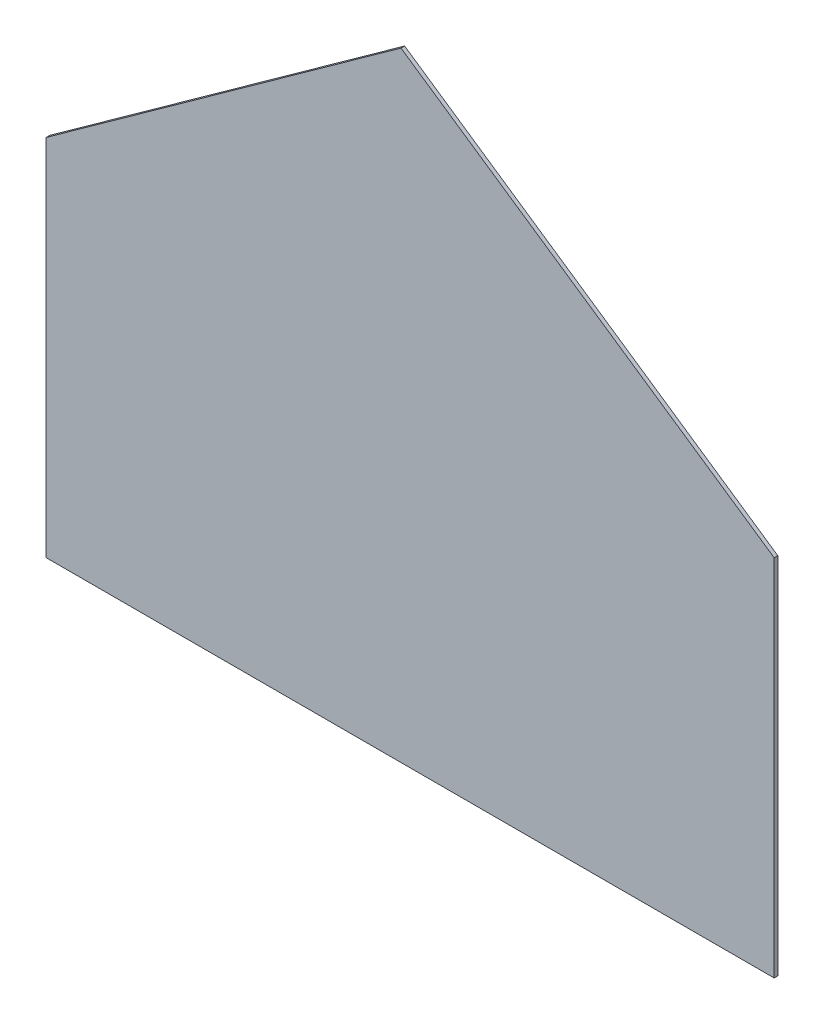
ISO-10303-21;
HEADER;
FILE_DESCRIPTION(('STEP AP214'),'2;1');
FILE_NAME('part.step','',(''),(''),'','','');
FILE_SCHEMA(('AUTOMOTIVE_DESIGN { 1 0 10303 214 1 1 1 1 }'));
ENDSEC;
DATA;
#1=APPLICATION_CONTEXT('core data for automotive mechanical design processes');
#2=APPLICATION_PROTOCOL_DEFINITION('international standard','automotive_design',2000,#1);
#3=PRODUCT_CONTEXT('',#1,'mechanical');
#4=PRODUCT('Part','Part','',(#3));
#5=PRODUCT_RELATED_PRODUCT_CATEGORY('part','',(#4));
#6=PRODUCT_DEFINITION_FORMATION('','',#4);
#7=PRODUCT_DEFINITION_CONTEXT('part definition',#1,'design');
#8=PRODUCT_DEFINITION('design','',#6,#7);
#9=PRODUCT_DEFINITION_SHAPE('','',#8);
#10=(LENGTH_UNIT() NAMED_UNIT(*) SI_UNIT(.MILLI.,.METRE.));
#11=(NAMED_UNIT(*) PLANE_ANGLE_UNIT() SI_UNIT($,.RADIAN.));
#12=(NAMED_UNIT(*) SI_UNIT($,.STERADIAN.) SOLID_ANGLE_UNIT());
#13=UNCERTAINTY_MEASURE_WITH_UNIT(LENGTH_MEASURE(1.E-05),#10,'distance_accuracy_value','');
#14=(GEOMETRIC_REPRESENTATION_CONTEXT(3) GLOBAL_UNCERTAINTY_ASSIGNED_CONTEXT((#13)) GLOBAL_UNIT_ASSIGNED_CONTEXT((#10,
#11,#12)) REPRESENTATION_CONTEXT('',''));
#15=CARTESIAN_POINT('',(0.,0.,0.));
#16=DIRECTION('',(0.,0.,1.));
#17=DIRECTION('',(1.,0.,0.));
#18=AXIS2_PLACEMENT_3D('',#15,#16,#17);
#19=CARTESIAN_POINT('',(-254.,0.,1.27));
#20=DIRECTION('',(1.,0.,0.));
#21=DIRECTION('',(0.,0.,-1.));
#22=AXIS2_PLACEMENT_3D('',#19,#20,#21);
#23=PLANE('',#22);
#24=DIRECTION('',(0.,-1.,0.));
#25=VECTOR('',#24,1.);
#26=CARTESIAN_POINT('',(-254.,0.,-1.27));
#27=LINE('',#26,#25);
#28=CARTESIAN_POINT('',(-254.,254.,-1.27));
#29=VERTEX_POINT('',#28);
#30=CARTESIAN_POINT('',(-254.,0.,-1.27));
#31=VERTEX_POINT('',#30);
#32=EDGE_CURVE('E122',#29,#31,#27,.T.);
#33=ORIENTED_EDGE('',*,*,#32,.T.);
#34=DIRECTION('',(0.,0.,-1.));
#35=VECTOR('',#34,1.);
#36=CARTESIAN_POINT('',(-254.,0.,1.27));
#37=LINE('',#36,#35);
#38=CARTESIAN_POINT('',(-254.,0.,1.27));
#39=VERTEX_POINT('',#38);
#40=EDGE_CURVE('E11',#39,#31,#37,.T.);
#41=ORIENTED_EDGE('',*,*,#40,.F.);
#42=DIRECTION('',(0.,-1.,0.));
#43=VECTOR('',#42,1.);
#44=CARTESIAN_POINT('',(-254.,0.,1.27));
#45=LINE('',#44,#43);
#46=CARTESIAN_POINT('',(-254.,254.,1.27));
#47=VERTEX_POINT('',#46);
#48=EDGE_CURVE('E135',#47,#39,#45,.T.);
#49=ORIENTED_EDGE('',*,*,#48,.F.);
#50=DIRECTION('',(0.,0.,-1.));
#51=VECTOR('',#50,1.);
#52=CARTESIAN_POINT('',(-254.,254.,1.27));
#53=LINE('',#52,#51);
#54=EDGE_CURVE('E118',#47,#29,#53,.T.);
#55=ORIENTED_EDGE('',*,*,#54,.T.);
#56=EDGE_LOOP('',(#33,#41,#49,#55));
#57=FACE_BOUND('',#56,.T.);
#58=ADVANCED_FACE('F43',(#57),#23,.F.);
#59=CARTESIAN_POINT('',(-254.,0.,1.27));
#60=DIRECTION('',(0.,1.,0.));
#61=DIRECTION('',(-1.,0.,0.));
#62=AXIS2_PLACEMENT_3D('',#59,#60,#61);
#63=PLANE('',#62);
#64=DIRECTION('',(1.,0.,0.));
#65=VECTOR('',#64,1.);
#66=CARTESIAN_POINT('',(-254.,0.,-1.27));
#67=LINE('',#66,#65);
#68=CARTESIAN_POINT('',(254.,0.,-1.27));
#69=VERTEX_POINT('',#68);
#70=EDGE_CURVE('E126',#31,#69,#67,.T.);
#71=ORIENTED_EDGE('',*,*,#70,.T.);
#72=DIRECTION('',(0.,0.,-1.));
#73=VECTOR('',#72,1.);
#74=CARTESIAN_POINT('',(254.,0.,1.27));
#75=LINE('',#74,#73);
#76=CARTESIAN_POINT('',(254.,0.,1.27));
#77=VERTEX_POINT('',#76);
#78=EDGE_CURVE('E52',#77,#69,#75,.T.);
#79=ORIENTED_EDGE('',*,*,#78,.F.);
#80=DIRECTION('',(1.,0.,0.));
#81=VECTOR('',#80,1.);
#82=CARTESIAN_POINT('',(-254.,0.,1.27));
#83=LINE('',#82,#81);
#84=EDGE_CURVE('E94',#39,#77,#83,.T.);
#85=ORIENTED_EDGE('',*,*,#84,.F.);
#86=ORIENTED_EDGE('',*,*,#40,.T.);
#87=EDGE_LOOP('',(#71,#79,#85,#86));
#88=FACE_BOUND('',#87,.T.);
#89=ADVANCED_FACE('F157',(#88),#63,.F.);
#90=CARTESIAN_POINT('',(254.,0.,1.27));
#91=DIRECTION('',(-1.,0.,0.));
#92=DIRECTION('',(0.,0.,1.));
#93=AXIS2_PLACEMENT_3D('',#90,#91,#92);
#94=PLANE('',#93);
#95=DIRECTION('',(0.,1.,0.));
#96=VECTOR('',#95,1.);
#97=CARTESIAN_POINT('',(254.,0.,-1.27));
#98=LINE('',#97,#96);
#99=CARTESIAN_POINT('',(254.,254.,-1.27));
#100=VERTEX_POINT('',#99);
#101=EDGE_CURVE('E110',#69,#100,#98,.T.);
#102=ORIENTED_EDGE('',*,*,#101,.T.);
#103=DIRECTION('',(0.,0.,-1.));
#104=VECTOR('',#103,1.);
#105=CARTESIAN_POINT('',(254.,254.,1.27));
#106=LINE('',#105,#104);
#107=CARTESIAN_POINT('',(254.,254.,1.27));
#108=VERTEX_POINT('',#107);
#109=EDGE_CURVE('E107',#108,#100,#106,.T.);
#110=ORIENTED_EDGE('',*,*,#109,.F.);
#111=DIRECTION('',(0.,1.,0.));
#112=VECTOR('',#111,1.);
#113=CARTESIAN_POINT('',(254.,0.,1.27));
#114=LINE('',#113,#112);
#115=EDGE_CURVE('E98',#77,#108,#114,.T.);
#116=ORIENTED_EDGE('',*,*,#115,.F.);
#117=ORIENTED_EDGE('',*,*,#78,.T.);
#118=EDGE_LOOP('',(#102,#110,#116,#117));
#119=FACE_BOUND('',#118,.T.);
#120=ADVANCED_FACE('F108',(#119),#94,.F.);
#121=CARTESIAN_POINT('',(-6.41461279698348,431.776590257358,1.27));
#122=DIRECTION('',(-0.563815572471546,-0.825900720570326,0.));
#123=DIRECTION('',(0.825900720570326,-0.563815572471546,0.));
#124=AXIS2_PLACEMENT_3D('',#121,#122,#123);
#125=PLANE('',#124);
#126=DIRECTION('',(-0.825900720570326,0.563815572471546,0.));
#127=VECTOR('',#126,1.);
#128=CARTESIAN_POINT('',(-6.41461279698348,431.776590257358,-1.27));
#129=LINE('',#128,#127);
#130=CARTESIAN_POINT('',(-6.41461279698348,431.776590257358,-1.27));
#131=VERTEX_POINT('',#130);
#132=EDGE_CURVE('E80',#100,#131,#129,.T.);
#133=ORIENTED_EDGE('',*,*,#132,.T.);
#134=DIRECTION('',(0.,0.,-1.));
#135=VECTOR('',#134,1.);
#136=CARTESIAN_POINT('',(-6.41461279698348,431.776590257358,1.27));
#137=LINE('',#136,#135);
#138=CARTESIAN_POINT('',(-6.41461279698348,431.776590257358,1.27));
#139=VERTEX_POINT('',#138);
#140=EDGE_CURVE('E112',#139,#131,#137,.T.);
#141=ORIENTED_EDGE('',*,*,#140,.F.);
#142=DIRECTION('',(-0.825900720570326,0.563815572471546,0.));
#143=VECTOR('',#142,1.);
#144=CARTESIAN_POINT('',(-6.41461279698348,431.776590257358,1.27));
#145=LINE('',#144,#143);
#146=EDGE_CURVE('E102',#108,#139,#145,.T.);
#147=ORIENTED_EDGE('',*,*,#146,.F.);
#148=ORIENTED_EDGE('',*,*,#109,.T.);
#149=EDGE_LOOP('',(#133,#141,#147,#148));
#150=FACE_BOUND('',#149,.T.);
#151=ADVANCED_FACE('F114',(#150),#125,.F.);
#152=CARTESIAN_POINT('',(-254.,254.,1.27));
#153=DIRECTION('',(0.58325652971574,-0.812288015757928,0.));
#154=DIRECTION('',(0.812288015757928,0.58325652971574,0.));
#155=AXIS2_PLACEMENT_3D('',#152,#153,#154);
#156=PLANE('',#155);
#157=DIRECTION('',(-0.812288015757928,-0.58325652971574,0.));
#158=VECTOR('',#157,1.);
#159=CARTESIAN_POINT('',(-254.,254.,-1.27));
#160=LINE('',#159,#158);
#161=EDGE_CURVE('E86',#131,#29,#160,.T.);
#162=ORIENTED_EDGE('',*,*,#161,.T.);
#163=ORIENTED_EDGE('',*,*,#54,.F.);
#164=DIRECTION('',(-0.812288015757928,-0.58325652971574,0.));
#165=VECTOR('',#164,1.);
#166=CARTESIAN_POINT('',(-254.,254.,1.27));
#167=LINE('',#166,#165);
#168=EDGE_CURVE('E60',#139,#47,#167,.T.);
#169=ORIENTED_EDGE('',*,*,#168,.F.);
#170=ORIENTED_EDGE('',*,*,#140,.T.);
#171=EDGE_LOOP('',(#162,#163,#169,#170));
#172=FACE_BOUND('',#171,.T.);
#173=ADVANCED_FACE('F146',(#172),#156,.F.);
#174=CARTESIAN_POINT('',(0.,0.,1.27));
#175=DIRECTION('',(0.,0.,-1.));
#176=DIRECTION('',(-1.,0.,0.));
#177=AXIS2_PLACEMENT_3D('',#174,#175,#176);
#178=PLANE('',#177);
#179=ORIENTED_EDGE('',*,*,#48,.T.);
#180=ORIENTED_EDGE('',*,*,#84,.T.);
#181=ORIENTED_EDGE('',*,*,#115,.T.);
#182=ORIENTED_EDGE('',*,*,#146,.T.);
#183=ORIENTED_EDGE('',*,*,#168,.T.);
#184=EDGE_LOOP('',(#179,#180,#181,#182,#183));
#185=FACE_BOUND('',#184,.T.);
#186=ADVANCED_FACE('F100',(#185),#178,.F.);
#187=CARTESIAN_POINT('',(0.,0.,-1.27));
#188=DIRECTION('',(0.,0.,-1.));
#189=DIRECTION('',(-1.,0.,0.));
#190=AXIS2_PLACEMENT_3D('',#187,#188,#189);
#191=PLANE('',#190);
#192=ORIENTED_EDGE('',*,*,#32,.F.);
#193=ORIENTED_EDGE('',*,*,#161,.F.);
#194=ORIENTED_EDGE('',*,*,#132,.F.);
#195=ORIENTED_EDGE('',*,*,#101,.F.);
#196=ORIENTED_EDGE('',*,*,#70,.F.);
#197=EDGE_LOOP('',(#192,#193,#194,#195,#196));
#198=FACE_BOUND('',#197,.T.);
#199=ADVANCED_FACE('F142',(#198),#191,.T.);
#200=CLOSED_SHELL('',(#58,#89,#120,#151,#173,#186,#199));
#201=MANIFOLD_SOLID_BREP('B2',#200);
#202=ADVANCED_BREP_SHAPE_REPRESENTATION('',(#18,#201),#14);
#203=SHAPE_DEFINITION_REPRESENTATION(#9,#202);
ENDSEC;
END-ISO-10303-21;
